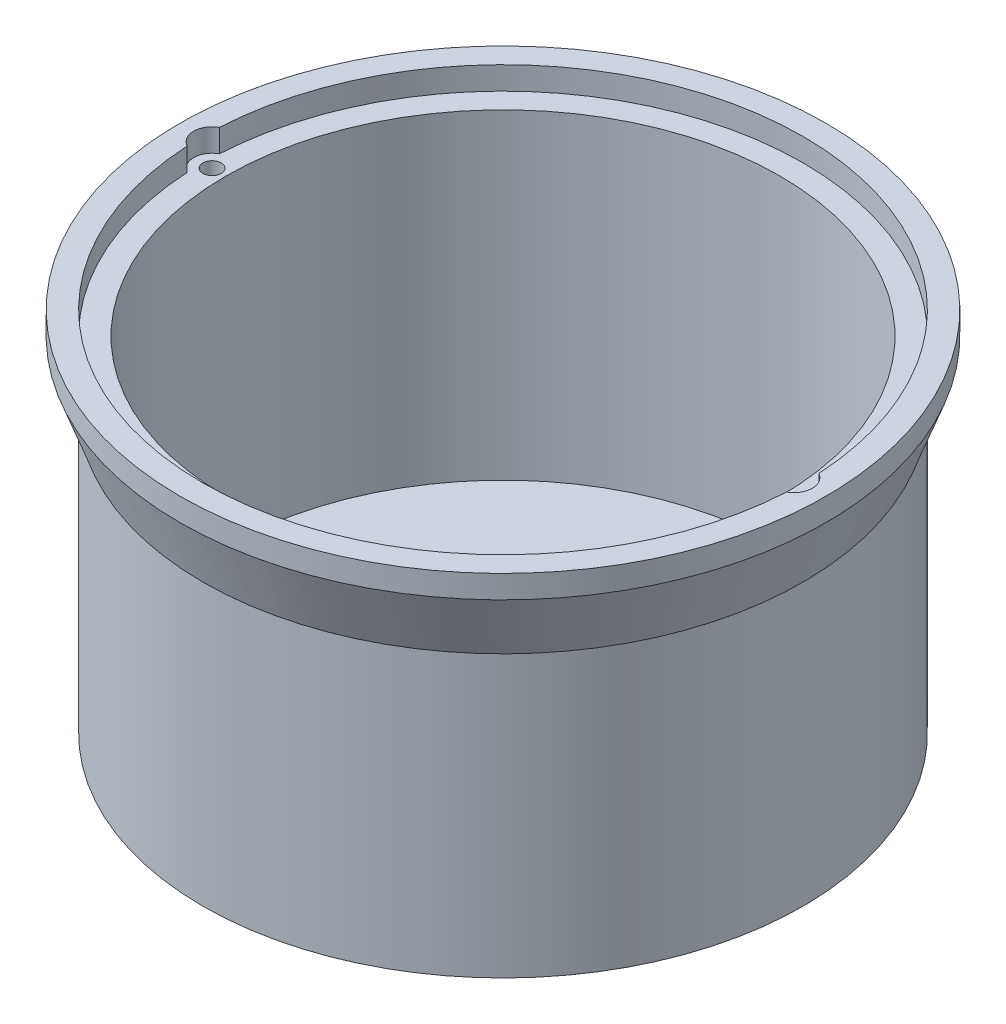
ISO-10303-21;
HEADER;
FILE_DESCRIPTION(('STEP AP214'),'2;1');
FILE_NAME('part.step','',(''),(''),'','','');
FILE_SCHEMA(('AUTOMOTIVE_DESIGN { 1 0 10303 214 1 1 1 1 }'));
ENDSEC;
DATA;
#1=APPLICATION_CONTEXT('core data for automotive mechanical design processes');
#2=APPLICATION_PROTOCOL_DEFINITION('international standard','automotive_design',2000,#1);
#3=PRODUCT_CONTEXT('',#1,'mechanical');
#4=PRODUCT('Part','Part','',(#3));
#5=PRODUCT_RELATED_PRODUCT_CATEGORY('part','',(#4));
#6=PRODUCT_DEFINITION_FORMATION('','',#4);
#7=PRODUCT_DEFINITION_CONTEXT('part definition',#1,'design');
#8=PRODUCT_DEFINITION('design','',#6,#7);
#9=PRODUCT_DEFINITION_SHAPE('','',#8);
#10=(LENGTH_UNIT() NAMED_UNIT(*) SI_UNIT(.MILLI.,.METRE.));
#11=(NAMED_UNIT(*) PLANE_ANGLE_UNIT() SI_UNIT($,.RADIAN.));
#12=(NAMED_UNIT(*) SI_UNIT($,.STERADIAN.) SOLID_ANGLE_UNIT());
#13=UNCERTAINTY_MEASURE_WITH_UNIT(LENGTH_MEASURE(1.E-05),#10,'distance_accuracy_value','');
#14=(GEOMETRIC_REPRESENTATION_CONTEXT(3) GLOBAL_UNCERTAINTY_ASSIGNED_CONTEXT((#13)) GLOBAL_UNIT_ASSIGNED_CONTEXT((#10,
#11,#12)) REPRESENTATION_CONTEXT('',''));
#15=CARTESIAN_POINT('',(0.,0.,0.));
#16=DIRECTION('',(0.,0.,1.));
#17=DIRECTION('',(1.,0.,0.));
#18=AXIS2_PLACEMENT_3D('',#15,#16,#17);
#19=CARTESIAN_POINT('',(0.,75.,0.));
#20=DIRECTION('',(0.,-1.,0.));
#21=DIRECTION('',(0.,0.,-1.));
#22=AXIS2_PLACEMENT_3D('',#19,#20,#21);
#23=PLANE('',#22);
#24=CARTESIAN_POINT('',(0.,75.,0.));
#25=DIRECTION('',(0.,1.,0.));
#26=DIRECTION('',(0.,0.,1.));
#27=AXIS2_PLACEMENT_3D('',#24,#25,#26);
#28=CIRCLE('',#27,65.5);
#29=CARTESIAN_POINT('',(65.4055118110236,75.,-3.51696243057126));
#30=VERTEX_POINT('',#29);
#31=CARTESIAN_POINT('',(-65.4055118110236,75.,-3.51696243057129));
#32=VERTEX_POINT('',#31);
#33=EDGE_CURVE('E96',#30,#32,#28,.T.);
#34=ORIENTED_EDGE('',*,*,#33,.T.);
#35=CARTESIAN_POINT('',(-63.5,75.,0.));
#36=DIRECTION('',(0.,1.,0.));
#37=DIRECTION('',(0.,0.,1.));
#38=AXIS2_PLACEMENT_3D('',#35,#36,#37);
#39=CIRCLE('',#38,4.00000000000001);
#40=CARTESIAN_POINT('',(-65.4055118110236,75.,3.51696243057127));
#41=VERTEX_POINT('',#40);
#42=EDGE_CURVE('E57',#32,#41,#39,.T.);
#43=ORIENTED_EDGE('',*,*,#42,.T.);
#44=CARTESIAN_POINT('',(65.4055118110236,75.,3.51696243057132));
#45=VERTEX_POINT('',#44);
#46=EDGE_CURVE('E98',#41,#45,#28,.T.);
#47=ORIENTED_EDGE('',*,*,#46,.T.);
#48=CARTESIAN_POINT('',(63.5,75.,0.));
#49=DIRECTION('',(0.,1.,0.));
#50=DIRECTION('',(0.,0.,-1.));
#51=AXIS2_PLACEMENT_3D('',#48,#49,#50);
#52=CIRCLE('',#51,4.00000000000001);
#53=EDGE_CURVE('E65',#45,#30,#52,.T.);
#54=ORIENTED_EDGE('',*,*,#53,.T.);
#55=EDGE_LOOP('',(#34,#43,#47,#54));
#56=FACE_BOUND('',#55,.T.);
#57=CARTESIAN_POINT('',(0.,75.,0.));
#58=DIRECTION('',(0.,1.,0.));
#59=DIRECTION('',(0.,0.,1.));
#60=AXIS2_PLACEMENT_3D('',#57,#58,#59);
#61=CIRCLE('',#60,60.5);
#62=CARTESIAN_POINT('',(0.,75.,60.5));
#63=VERTEX_POINT('',#62);
#64=EDGE_CURVE('E101',#63,#63,#61,.T.);
#65=ORIENTED_EDGE('',*,*,#64,.F.);
#66=EDGE_LOOP('',(#65));
#67=FACE_BOUND('',#66,.T.);
#68=CARTESIAN_POINT('',(63.5,75.,0.));
#69=DIRECTION('',(0.,1.,0.));
#70=DIRECTION('',(0.,0.,1.));
#71=AXIS2_PLACEMENT_3D('',#68,#69,#70);
#72=CIRCLE('',#71,2.);
#73=CARTESIAN_POINT('',(63.5,75.,2.));
#74=VERTEX_POINT('',#73);
#75=EDGE_CURVE('E164',#74,#74,#72,.F.);
#76=ORIENTED_EDGE('',*,*,#75,.T.);
#77=EDGE_LOOP('',(#76));
#78=FACE_BOUND('',#77,.T.);
#79=CARTESIAN_POINT('',(-63.5,75.,0.));
#80=DIRECTION('',(0.,1.,0.));
#81=DIRECTION('',(0.,0.,1.));
#82=AXIS2_PLACEMENT_3D('',#79,#80,#81);
#83=CIRCLE('',#82,2.);
#84=CARTESIAN_POINT('',(-63.5,75.,2.00000000000003));
#85=VERTEX_POINT('',#84);
#86=EDGE_CURVE('E167',#85,#85,#83,.T.);
#87=ORIENTED_EDGE('',*,*,#86,.F.);
#88=EDGE_LOOP('',(#87));
#89=FACE_BOUND('',#88,.T.);
#90=ADVANCED_FACE('F42',(#56,#67,#78,#89),#23,.F.);
#91=CARTESIAN_POINT('',(0.,4.99999999999875,0.));
#92=DIRECTION('',(0.,1.,0.));
#93=DIRECTION('',(0.,0.,1.));
#94=AXIS2_PLACEMENT_3D('',#91,#92,#93);
#95=CYLINDRICAL_SURFACE('',#94,65.5);
#96=DIRECTION('',(0.,-1.,0.));
#97=VECTOR('',#96,1.);
#98=CARTESIAN_POINT('',(-65.4055118110236,77.5,3.51696243057128));
#99=LINE('',#98,#97);
#100=CARTESIAN_POINT('',(-65.4055118110236,80.,3.51696243057126));
#101=VERTEX_POINT('',#100);
#102=EDGE_CURVE('E184',#101,#41,#99,.T.);
#103=ORIENTED_EDGE('',*,*,#102,.F.);
#104=CARTESIAN_POINT('',(0.,80.,0.));
#105=DIRECTION('',(0.,1.,0.));
#106=DIRECTION('',(0.,0.,1.));
#107=AXIS2_PLACEMENT_3D('',#104,#105,#106);
#108=CIRCLE('',#107,65.5);
#109=CARTESIAN_POINT('',(65.4055118110236,80.,3.51696243057126));
#110=VERTEX_POINT('',#109);
#111=EDGE_CURVE('E108',#101,#110,#108,.T.);
#112=ORIENTED_EDGE('',*,*,#111,.T.);
#113=DIRECTION('',(0.,-1.,0.));
#114=VECTOR('',#113,1.);
#115=CARTESIAN_POINT('',(65.4055118110236,77.5,3.51696243057127));
#116=LINE('',#115,#114);
#117=EDGE_CURVE('E90',#45,#110,#116,.F.);
#118=ORIENTED_EDGE('',*,*,#117,.F.);
#119=ORIENTED_EDGE('',*,*,#46,.F.);
#120=EDGE_LOOP('',(#103,#112,#118,#119));
#121=FACE_BOUND('',#120,.T.);
#122=ADVANCED_FACE('F134',(#121),#95,.F.);
#123=DIRECTION('',(0.,-1.,0.));
#124=VECTOR('',#123,1.);
#125=CARTESIAN_POINT('',(-65.4055118110236,77.5,-3.51696243057123));
#126=LINE('',#125,#124);
#127=CARTESIAN_POINT('',(-65.4055118110236,80.,-3.51696243057121));
#128=VERTEX_POINT('',#127);
#129=EDGE_CURVE('E89',#32,#128,#126,.F.);
#130=ORIENTED_EDGE('',*,*,#129,.F.);
#131=ORIENTED_EDGE('',*,*,#33,.F.);
#132=DIRECTION('',(0.,-1.,0.));
#133=VECTOR('',#132,1.);
#134=CARTESIAN_POINT('',(65.4055118110236,77.5,-3.51696243057126));
#135=LINE('',#134,#133);
#136=CARTESIAN_POINT('',(65.4055118110236,80.,-3.51696243057125));
#137=VERTEX_POINT('',#136);
#138=EDGE_CURVE('E81',#137,#30,#135,.T.);
#139=ORIENTED_EDGE('',*,*,#138,.F.);
#140=EDGE_CURVE('E106',#137,#128,#108,.T.);
#141=ORIENTED_EDGE('',*,*,#140,.T.);
#142=EDGE_LOOP('',(#130,#131,#139,#141));
#143=FACE_BOUND('',#142,.T.);
#144=ADVANCED_FACE('F100',(#143),#95,.F.);
#145=CARTESIAN_POINT('',(0.,0.,0.));
#146=DIRECTION('',(0.,1.,0.));
#147=DIRECTION('',(0.,0.,1.));
#148=AXIS2_PLACEMENT_3D('',#145,#146,#147);
#149=PLANE('',#148);
#150=CARTESIAN_POINT('',(0.,0.,0.));
#151=DIRECTION('',(0.,1.,0.));
#152=DIRECTION('',(0.,0.,1.));
#153=AXIS2_PLACEMENT_3D('',#150,#151,#152);
#154=CIRCLE('',#153,65.5);
#155=CARTESIAN_POINT('',(0.,0.,65.5));
#156=VERTEX_POINT('',#155);
#157=EDGE_CURVE('E113',#156,#156,#154,.T.);
#158=ORIENTED_EDGE('',*,*,#157,.F.);
#159=EDGE_LOOP('',(#158));
#160=FACE_BOUND('',#159,.T.);
#161=ADVANCED_FACE('F124',(#160),#149,.F.);
#162=CARTESIAN_POINT('',(0.,4.99999999999875,0.));
#163=DIRECTION('',(0.,1.,0.));
#164=DIRECTION('',(0.,0.,1.));
#165=AXIS2_PLACEMENT_3D('',#162,#163,#164);
#166=CYLINDRICAL_SURFACE('',#165,65.5);
#167=CARTESIAN_POINT('',(0.,61.2626129027269,0.));
#168=DIRECTION('',(0.,1.,0.));
#169=DIRECTION('',(0.,0.,1.));
#170=AXIS2_PLACEMENT_3D('',#167,#168,#169);
#171=CIRCLE('',#170,65.5);
#172=CARTESIAN_POINT('',(0.,61.2626129027269,65.5));
#173=VERTEX_POINT('',#172);
#174=EDGE_CURVE('E50',#173,#173,#171,.T.);
#175=ORIENTED_EDGE('',*,*,#174,.F.);
#176=EDGE_LOOP('',(#175));
#177=FACE_BOUND('',#176,.T.);
#178=ORIENTED_EDGE('',*,*,#157,.T.);
#179=EDGE_LOOP('',(#178));
#180=FACE_BOUND('',#179,.T.);
#181=ADVANCED_FACE('F121',(#177,#180),#166,.T.);
#182=CARTESIAN_POINT('',(0.,75.,0.));
#183=DIRECTION('',(0.,1.,0.));
#184=DIRECTION('',(0.,0.,1.));
#185=AXIS2_PLACEMENT_3D('',#182,#183,#184);
#186=CONICAL_SURFACE('',#185,70.5,0.349065850398868);
#187=ORIENTED_EDGE('',*,*,#174,.T.);
#188=EDGE_LOOP('',(#187));
#189=FACE_BOUND('',#188,.T.);
#190=CARTESIAN_POINT('',(0.,75.,0.));
#191=DIRECTION('',(0.,1.,0.));
#192=DIRECTION('',(0.,0.,1.));
#193=AXIS2_PLACEMENT_3D('',#190,#191,#192);
#194=CIRCLE('',#193,70.5);
#195=CARTESIAN_POINT('',(0.,75.,70.5));
#196=VERTEX_POINT('',#195);
#197=EDGE_CURVE('E11',#196,#196,#194,.T.);
#198=ORIENTED_EDGE('',*,*,#197,.F.);
#199=EDGE_LOOP('',(#198));
#200=FACE_BOUND('',#199,.T.);
#201=ADVANCED_FACE('F118',(#189,#200),#186,.T.);
#202=CARTESIAN_POINT('',(0.,80.,0.));
#203=DIRECTION('',(0.,-1.,0.));
#204=DIRECTION('',(0.,0.,-1.));
#205=AXIS2_PLACEMENT_3D('',#202,#203,#204);
#206=PLANE('',#205);
#207=CARTESIAN_POINT('',(-63.5,80.,0.));
#208=DIRECTION('',(0.,1.,0.));
#209=DIRECTION('',(0.,0.,1.));
#210=AXIS2_PLACEMENT_3D('',#207,#208,#209);
#211=CIRCLE('',#210,4.00000000000001);
#212=EDGE_CURVE('E178',#128,#101,#211,.T.);
#213=ORIENTED_EDGE('',*,*,#212,.F.);
#214=ORIENTED_EDGE('',*,*,#140,.F.);
#215=CARTESIAN_POINT('',(63.5,80.,0.));
#216=DIRECTION('',(0.,1.,0.));
#217=DIRECTION('',(0.,0.,-1.));
#218=AXIS2_PLACEMENT_3D('',#215,#216,#217);
#219=CIRCLE('',#218,4.00000000000001);
#220=EDGE_CURVE('E84',#110,#137,#219,.T.);
#221=ORIENTED_EDGE('',*,*,#220,.F.);
#222=ORIENTED_EDGE('',*,*,#111,.F.);
#223=EDGE_LOOP('',(#213,#214,#221,#222));
#224=FACE_BOUND('',#223,.T.);
#225=CARTESIAN_POINT('',(0.,80.,0.));
#226=DIRECTION('',(0.,1.,0.));
#227=DIRECTION('',(0.,0.,1.));
#228=AXIS2_PLACEMENT_3D('',#225,#226,#227);
#229=CIRCLE('',#228,70.5);
#230=CARTESIAN_POINT('',(0.,80.,70.5));
#231=VERTEX_POINT('',#230);
#232=EDGE_CURVE('E185',#231,#231,#229,.T.);
#233=ORIENTED_EDGE('',*,*,#232,.T.);
#234=EDGE_LOOP('',(#233));
#235=FACE_BOUND('',#234,.T.);
#236=ADVANCED_FACE('F136',(#224,#235),#206,.F.);
#237=CARTESIAN_POINT('',(0.,4.99999999999875,0.));
#238=DIRECTION('',(0.,1.,0.));
#239=DIRECTION('',(0.,0.,1.));
#240=AXIS2_PLACEMENT_3D('',#237,#238,#239);
#241=CYLINDRICAL_SURFACE('',#240,70.5);
#242=ORIENTED_EDGE('',*,*,#197,.T.);
#243=EDGE_LOOP('',(#242));
#244=FACE_BOUND('',#243,.T.);
#245=ORIENTED_EDGE('',*,*,#232,.F.);
#246=EDGE_LOOP('',(#245));
#247=FACE_BOUND('',#246,.T.);
#248=ADVANCED_FACE('F44',(#244,#247),#241,.T.);
#249=CARTESIAN_POINT('',(0.,4.99999999999875,0.));
#250=DIRECTION('',(0.,1.,0.));
#251=DIRECTION('',(0.,0.,1.));
#252=AXIS2_PLACEMENT_3D('',#249,#250,#251);
#253=CYLINDRICAL_SURFACE('',#252,60.5);
#254=CARTESIAN_POINT('',(0.,4.99999999999999,0.));
#255=DIRECTION('',(0.,1.,0.));
#256=DIRECTION('',(0.,0.,1.));
#257=AXIS2_PLACEMENT_3D('',#254,#255,#256);
#258=CIRCLE('',#257,60.5);
#259=CARTESIAN_POINT('',(0.,4.99999999999999,60.5));
#260=VERTEX_POINT('',#259);
#261=EDGE_CURVE('E104',#260,#260,#258,.T.);
#262=ORIENTED_EDGE('',*,*,#261,.F.);
#263=EDGE_LOOP('',(#262));
#264=FACE_BOUND('',#263,.T.);
#265=ORIENTED_EDGE('',*,*,#64,.T.);
#266=EDGE_LOOP('',(#265));
#267=FACE_BOUND('',#266,.T.);
#268=ADVANCED_FACE('F147',(#264,#267),#253,.F.);
#269=CARTESIAN_POINT('',(1.0279311836984E-13,4.99999999999937,0.));
#270=DIRECTION('',(0.,-1.,0.));
#271=DIRECTION('',(0.,0.,-1.));
#272=AXIS2_PLACEMENT_3D('',#269,#270,#271);
#273=PLANE('',#272);
#274=ORIENTED_EDGE('',*,*,#261,.T.);
#275=EDGE_LOOP('',(#274));
#276=FACE_BOUND('',#275,.T.);
#277=ADVANCED_FACE('F126',(#276),#273,.F.);
#278=CARTESIAN_POINT('',(63.5,80.,0.));
#279=DIRECTION('',(0.,-1.,0.));
#280=DIRECTION('',(0.,0.,-1.));
#281=AXIS2_PLACEMENT_3D('',#278,#279,#280);
#282=CYLINDRICAL_SURFACE('',#281,4.00000000000001);
#283=ORIENTED_EDGE('',*,*,#138,.T.);
#284=ORIENTED_EDGE('',*,*,#53,.F.);
#285=ORIENTED_EDGE('',*,*,#117,.T.);
#286=ORIENTED_EDGE('',*,*,#220,.T.);
#287=EDGE_LOOP('',(#283,#284,#285,#286));
#288=FACE_BOUND('',#287,.T.);
#289=ADVANCED_FACE('F82',(#288),#282,.F.);
#290=CARTESIAN_POINT('',(-63.5,80.,0.));
#291=DIRECTION('',(0.,-1.,0.));
#292=DIRECTION('',(0.,0.,-1.));
#293=AXIS2_PLACEMENT_3D('',#290,#291,#292);
#294=CYLINDRICAL_SURFACE('',#293,4.00000000000001);
#295=ORIENTED_EDGE('',*,*,#102,.T.);
#296=ORIENTED_EDGE('',*,*,#42,.F.);
#297=ORIENTED_EDGE('',*,*,#129,.T.);
#298=ORIENTED_EDGE('',*,*,#212,.T.);
#299=EDGE_LOOP('',(#295,#296,#297,#298));
#300=FACE_BOUND('',#299,.T.);
#301=ADVANCED_FACE('F155',(#300),#294,.F.);
#302=CARTESIAN_POINT('',(63.5,72.,0.));
#303=DIRECTION('',(0.,1.,0.));
#304=DIRECTION('',(0.,0.,1.));
#305=AXIS2_PLACEMENT_3D('',#302,#303,#304);
#306=CYLINDRICAL_SURFACE('',#305,2.);
#307=CARTESIAN_POINT('',(63.5,72.,0.));
#308=DIRECTION('',(0.,1.,0.));
#309=DIRECTION('',(0.,0.,1.));
#310=AXIS2_PLACEMENT_3D('',#307,#308,#309);
#311=CIRCLE('',#310,2.);
#312=CARTESIAN_POINT('',(63.5,72.,2.));
#313=VERTEX_POINT('',#312);
#314=EDGE_CURVE('E170',#313,#313,#311,.F.);
#315=ORIENTED_EDGE('',*,*,#314,.T.);
#316=EDGE_LOOP('',(#315));
#317=FACE_BOUND('',#316,.T.);
#318=ORIENTED_EDGE('',*,*,#75,.F.);
#319=EDGE_LOOP('',(#318));
#320=FACE_BOUND('',#319,.T.);
#321=ADVANCED_FACE('F195',(#317,#320),#306,.F.);
#322=CARTESIAN_POINT('',(0.,72.,0.));
#323=DIRECTION('',(0.,1.,0.));
#324=DIRECTION('',(0.,0.,1.));
#325=AXIS2_PLACEMENT_3D('',#322,#323,#324);
#326=PLANE('',#325);
#327=ORIENTED_EDGE('',*,*,#314,.F.);
#328=EDGE_LOOP('',(#327));
#329=FACE_BOUND('',#328,.T.);
#330=ADVANCED_FACE('F200',(#329),#326,.T.);
#331=CARTESIAN_POINT('',(-63.5,72.,0.));
#332=DIRECTION('',(0.,1.,0.));
#333=DIRECTION('',(0.,0.,1.));
#334=AXIS2_PLACEMENT_3D('',#331,#332,#333);
#335=CYLINDRICAL_SURFACE('',#334,2.);
#336=CARTESIAN_POINT('',(-63.5,72.,0.));
#337=DIRECTION('',(0.,1.,0.));
#338=DIRECTION('',(0.,0.,1.));
#339=AXIS2_PLACEMENT_3D('',#336,#337,#338);
#340=CIRCLE('',#339,2.);
#341=CARTESIAN_POINT('',(-63.5,72.,2.00000000000003));
#342=VERTEX_POINT('',#341);
#343=EDGE_CURVE('E169',#342,#342,#340,.T.);
#344=ORIENTED_EDGE('',*,*,#343,.F.);
#345=EDGE_LOOP('',(#344));
#346=FACE_BOUND('',#345,.T.);
#347=ORIENTED_EDGE('',*,*,#86,.T.);
#348=EDGE_LOOP('',(#347));
#349=FACE_BOUND('',#348,.T.);
#350=ADVANCED_FACE('F257',(#346,#349),#335,.F.);
#351=CARTESIAN_POINT('',(0.,72.,0.));
#352=DIRECTION('',(0.,1.,0.));
#353=DIRECTION('',(0.,0.,1.));
#354=AXIS2_PLACEMENT_3D('',#351,#352,#353);
#355=PLANE('',#354);
#356=ORIENTED_EDGE('',*,*,#343,.T.);
#357=EDGE_LOOP('',(#356));
#358=FACE_BOUND('',#357,.T.);
#359=ADVANCED_FACE('F267',(#358),#355,.T.);
#360=CLOSED_SHELL('',(#90,#122,#144,#161,#181,#201,#236,#248,#268,#277,#289,#301,#321,#330,#350,#359));
#361=MANIFOLD_SOLID_BREP('B2',#360);
#362=ADVANCED_BREP_SHAPE_REPRESENTATION('',(#18,#361),#14);
#363=SHAPE_DEFINITION_REPRESENTATION(#9,#362);
ENDSEC;
END-ISO-10303-21;
